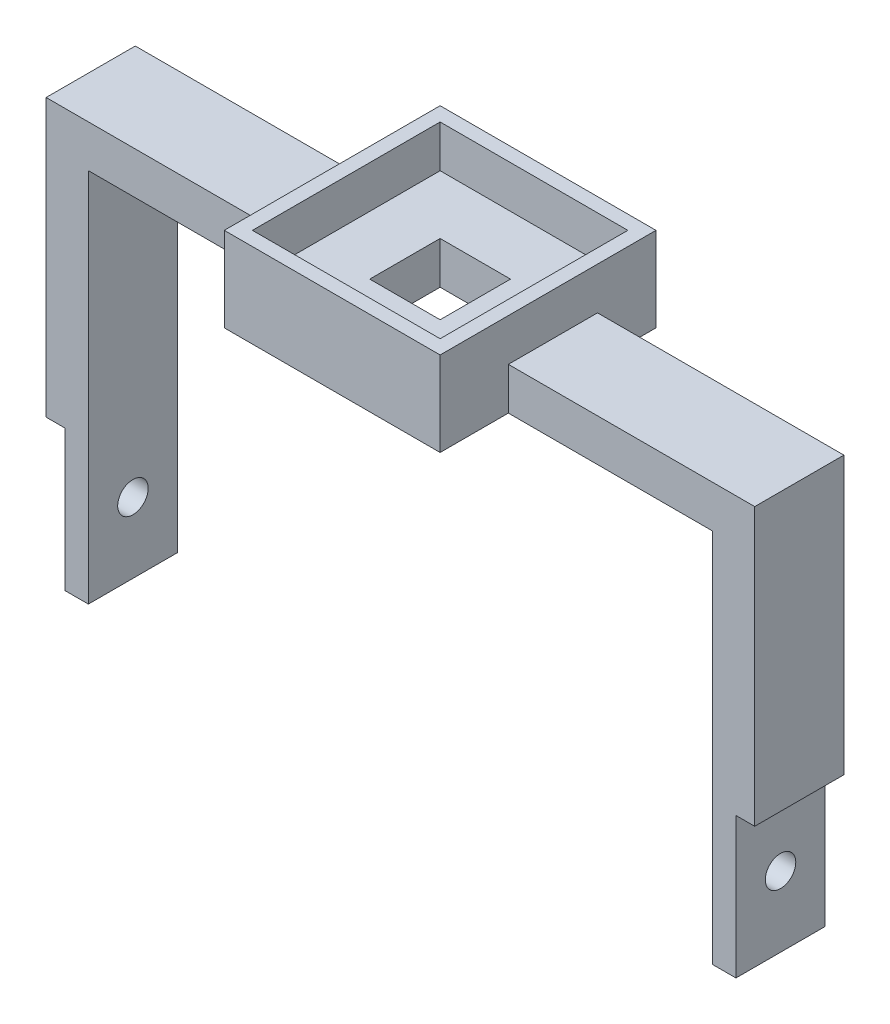
ISO-10303-21;
HEADER;
FILE_DESCRIPTION(('STEP AP214'),'2;1');
FILE_NAME('part.step','',(''),(''),'','','');
FILE_SCHEMA(('AUTOMOTIVE_DESIGN { 1 0 10303 214 1 1 1 1 }'));
ENDSEC;
DATA;
#1=APPLICATION_CONTEXT('core data for automotive mechanical design processes');
#2=APPLICATION_PROTOCOL_DEFINITION('international standard','automotive_design',2000,#1);
#3=PRODUCT_CONTEXT('',#1,'mechanical');
#4=PRODUCT('Part','Part','',(#3));
#5=PRODUCT_RELATED_PRODUCT_CATEGORY('part','',(#4));
#6=PRODUCT_DEFINITION_FORMATION('','',#4);
#7=PRODUCT_DEFINITION_CONTEXT('part definition',#1,'design');
#8=PRODUCT_DEFINITION('design','',#6,#7);
#9=PRODUCT_DEFINITION_SHAPE('','',#8);
#10=(LENGTH_UNIT() NAMED_UNIT(*) SI_UNIT(.MILLI.,.METRE.));
#11=(NAMED_UNIT(*) PLANE_ANGLE_UNIT() SI_UNIT($,.RADIAN.));
#12=(NAMED_UNIT(*) SI_UNIT($,.STERADIAN.) SOLID_ANGLE_UNIT());
#13=UNCERTAINTY_MEASURE_WITH_UNIT(LENGTH_MEASURE(1.E-05),#10,'distance_accuracy_value','');
#14=(GEOMETRIC_REPRESENTATION_CONTEXT(3) GLOBAL_UNCERTAINTY_ASSIGNED_CONTEXT((#13)) GLOBAL_UNIT_ASSIGNED_CONTEXT((#10,
#11,#12)) REPRESENTATION_CONTEXT('',''));
#15=CARTESIAN_POINT('',(0.,0.,0.));
#16=DIRECTION('',(0.,0.,1.));
#17=DIRECTION('',(1.,0.,0.));
#18=AXIS2_PLACEMENT_3D('',#15,#16,#17);
#19=CARTESIAN_POINT('',(0.,80.,19.));
#20=DIRECTION('',(0.,1.,0.));
#21=DIRECTION('',(0.,0.,1.));
#22=AXIS2_PLACEMENT_3D('',#19,#20,#21);
#23=PLANE('',#22);
#24=DIRECTION('',(1.,0.,0.));
#25=VECTOR('',#24,1.);
#26=CARTESIAN_POINT('',(0.,80.,19.));
#27=LINE('',#26,#25);
#28=CARTESIAN_POINT('',(89.5,80.,19.));
#29=VERTEX_POINT('',#28);
#30=CARTESIAN_POINT('',(133.,80.,19.));
#31=VERTEX_POINT('',#30);
#32=EDGE_CURVE('E330',#29,#31,#27,.T.);
#33=ORIENTED_EDGE('',*,*,#32,.F.);
#34=DIRECTION('',(0.,0.,1.));
#35=VECTOR('',#34,1.);
#36=CARTESIAN_POINT('',(89.5,80.,33.5381592490275));
#37=LINE('',#36,#35);
#38=CARTESIAN_POINT('',(89.5,80.,33.5381592490275));
#39=VERTEX_POINT('',#38);
#40=EDGE_CURVE('E282',#29,#39,#37,.T.);
#41=ORIENTED_EDGE('',*,*,#40,.T.);
#42=DIRECTION('',(-1.,0.,0.));
#43=VECTOR('',#42,1.);
#44=CARTESIAN_POINT('',(89.5,80.,33.5381592490275));
#45=LINE('',#44,#43);
#46=CARTESIAN_POINT('',(43.5,80.,33.5381592490275));
#47=VERTEX_POINT('',#46);
#48=EDGE_CURVE('E274',#39,#47,#45,.T.);
#49=ORIENTED_EDGE('',*,*,#48,.T.);
#50=DIRECTION('',(0.,0.,-1.));
#51=VECTOR('',#50,1.);
#52=CARTESIAN_POINT('',(43.5,80.,33.5381592490275));
#53=LINE('',#52,#51);
#54=CARTESIAN_POINT('',(43.5,80.,19.));
#55=VERTEX_POINT('',#54);
#56=EDGE_CURVE('E277',#47,#55,#53,.T.);
#57=ORIENTED_EDGE('',*,*,#56,.T.);
#58=CARTESIAN_POINT('',(0.,80.,19.));
#59=VERTEX_POINT('',#58);
#60=EDGE_CURVE('E331',#59,#55,#27,.T.);
#61=ORIENTED_EDGE('',*,*,#60,.F.);
#62=DIRECTION('',(0.,0.,-1.));
#63=VECTOR('',#62,1.);
#64=CARTESIAN_POINT('',(0.,80.,19.));
#65=LINE('',#64,#63);
#66=CARTESIAN_POINT('',(0.,80.,0.));
#67=VERTEX_POINT('',#66);
#68=EDGE_CURVE('E411',#59,#67,#65,.T.);
#69=ORIENTED_EDGE('',*,*,#68,.T.);
#70=DIRECTION('',(1.,0.,0.));
#71=VECTOR('',#70,1.);
#72=CARTESIAN_POINT('',(0.,80.,0.));
#73=LINE('',#72,#71);
#74=CARTESIAN_POINT('',(43.5,80.,0.));
#75=VERTEX_POINT('',#74);
#76=EDGE_CURVE('E360',#67,#75,#73,.T.);
#77=ORIENTED_EDGE('',*,*,#76,.T.);
#78=CARTESIAN_POINT('',(43.5,80.,-12.4618407509725));
#79=VERTEX_POINT('',#78);
#80=EDGE_CURVE('E284',#75,#79,#53,.T.);
#81=ORIENTED_EDGE('',*,*,#80,.T.);
#82=DIRECTION('',(1.,0.,0.));
#83=VECTOR('',#82,1.);
#84=CARTESIAN_POINT('',(89.5,80.,-12.4618407509725));
#85=LINE('',#84,#83);
#86=CARTESIAN_POINT('',(89.5,80.,-12.4618407509725));
#87=VERTEX_POINT('',#86);
#88=EDGE_CURVE('E281',#79,#87,#85,.T.);
#89=ORIENTED_EDGE('',*,*,#88,.T.);
#90=CARTESIAN_POINT('',(89.5,80.,0.));
#91=VERTEX_POINT('',#90);
#92=EDGE_CURVE('E278',#87,#91,#37,.T.);
#93=ORIENTED_EDGE('',*,*,#92,.T.);
#94=CARTESIAN_POINT('',(133.,80.,0.));
#95=VERTEX_POINT('',#94);
#96=EDGE_CURVE('E359',#91,#95,#73,.T.);
#97=ORIENTED_EDGE('',*,*,#96,.T.);
#98=DIRECTION('',(0.,0.,-1.));
#99=VECTOR('',#98,1.);
#100=CARTESIAN_POINT('',(133.,80.,19.));
#101=LINE('',#100,#99);
#102=EDGE_CURVE('E408',#31,#95,#101,.T.);
#103=ORIENTED_EDGE('',*,*,#102,.F.);
#104=EDGE_LOOP('',(#33,#41,#49,#57,#61,#69,#77,#81,#89,#93,#97,#103));
#105=FACE_BOUND('',#104,.T.);
#106=DIRECTION('',(0.,0.,1.));
#107=VECTOR('',#106,1.);
#108=CARTESIAN_POINT('',(59.,80.,18.0381592490275));
#109=LINE('',#108,#107);
#110=CARTESIAN_POINT('',(59.,80.,3.03815924902746));
#111=VERTEX_POINT('',#110);
#112=CARTESIAN_POINT('',(59.,80.,18.0381592490275));
#113=VERTEX_POINT('',#112);
#114=EDGE_CURVE('E49',#111,#113,#109,.T.);
#115=ORIENTED_EDGE('',*,*,#114,.T.);
#116=DIRECTION('',(1.,0.,0.));
#117=VECTOR('',#116,1.);
#118=CARTESIAN_POINT('',(74.,80.,18.0381592490275));
#119=LINE('',#118,#117);
#120=CARTESIAN_POINT('',(74.,80.,18.0381592490275));
#121=VERTEX_POINT('',#120);
#122=EDGE_CURVE('E227',#113,#121,#119,.T.);
#123=ORIENTED_EDGE('',*,*,#122,.T.);
#124=DIRECTION('',(0.,0.,-1.));
#125=VECTOR('',#124,1.);
#126=CARTESIAN_POINT('',(74.,80.,18.0381592490275));
#127=LINE('',#126,#125);
#128=CARTESIAN_POINT('',(74.,80.,3.03815924902746));
#129=VERTEX_POINT('',#128);
#130=EDGE_CURVE('E233',#121,#129,#127,.T.);
#131=ORIENTED_EDGE('',*,*,#130,.T.);
#132=DIRECTION('',(-1.,0.,0.));
#133=VECTOR('',#132,1.);
#134=CARTESIAN_POINT('',(74.,80.,3.03815924902746));
#135=LINE('',#134,#133);
#136=EDGE_CURVE('E236',#129,#111,#135,.T.);
#137=ORIENTED_EDGE('',*,*,#136,.T.);
#138=EDGE_LOOP('',(#115,#123,#131,#137));
#139=FACE_BOUND('',#138,.T.);
#140=ADVANCED_FACE('F33',(#105,#139),#23,.F.);
#141=CARTESIAN_POINT('',(142.,89.,19.));
#142=DIRECTION('',(0.,-1.,0.));
#143=DIRECTION('',(1.,0.,0.));
#144=AXIS2_PLACEMENT_3D('',#141,#142,#143);
#145=PLANE('',#144);
#146=DIRECTION('',(0.,0.,-1.));
#147=VECTOR('',#146,1.);
#148=CARTESIAN_POINT('',(86.5,89.,30.5381592490275));
#149=LINE('',#148,#147);
#150=CARTESIAN_POINT('',(86.5,89.,30.5381592490275));
#151=VERTEX_POINT('',#150);
#152=CARTESIAN_POINT('',(86.5,89.,-9.46184075097254));
#153=VERTEX_POINT('',#152);
#154=EDGE_CURVE('E312',#151,#153,#149,.T.);
#155=ORIENTED_EDGE('',*,*,#154,.T.);
#156=DIRECTION('',(-1.,0.,0.));
#157=VECTOR('',#156,1.);
#158=CARTESIAN_POINT('',(46.5,89.,-9.46184075097254));
#159=LINE('',#158,#157);
#160=CARTESIAN_POINT('',(46.5,89.,-9.46184075097254));
#161=VERTEX_POINT('',#160);
#162=EDGE_CURVE('E314',#153,#161,#159,.T.);
#163=ORIENTED_EDGE('',*,*,#162,.T.);
#164=DIRECTION('',(0.,0.,1.));
#165=VECTOR('',#164,1.);
#166=CARTESIAN_POINT('',(46.5,89.,30.5381592490275));
#167=LINE('',#166,#165);
#168=CARTESIAN_POINT('',(46.5,89.,30.5381592490275));
#169=VERTEX_POINT('',#168);
#170=EDGE_CURVE('E317',#161,#169,#167,.T.);
#171=ORIENTED_EDGE('',*,*,#170,.T.);
#172=DIRECTION('',(1.,0.,0.));
#173=VECTOR('',#172,1.);
#174=CARTESIAN_POINT('',(46.5,89.,30.5381592490275));
#175=LINE('',#174,#173);
#176=EDGE_CURVE('E320',#169,#151,#175,.T.);
#177=ORIENTED_EDGE('',*,*,#176,.T.);
#178=EDGE_LOOP('',(#155,#163,#171,#177));
#179=FACE_BOUND('',#178,.T.);
#180=DIRECTION('',(0.,0.,1.));
#181=VECTOR('',#180,1.);
#182=CARTESIAN_POINT('',(59.,89.,19.));
#183=LINE('',#182,#181);
#184=CARTESIAN_POINT('',(59.,89.,3.03815924902746));
#185=VERTEX_POINT('',#184);
#186=CARTESIAN_POINT('',(59.,89.,18.0381592490275));
#187=VERTEX_POINT('',#186);
#188=EDGE_CURVE('E11',#185,#187,#183,.T.);
#189=ORIENTED_EDGE('',*,*,#188,.F.);
#190=DIRECTION('',(-1.,0.,0.));
#191=VECTOR('',#190,1.);
#192=CARTESIAN_POINT('',(142.,89.,3.03815924902745));
#193=LINE('',#192,#191);
#194=CARTESIAN_POINT('',(74.,89.,3.03815924902746));
#195=VERTEX_POINT('',#194);
#196=EDGE_CURVE('E422',#195,#185,#193,.T.);
#197=ORIENTED_EDGE('',*,*,#196,.F.);
#198=DIRECTION('',(0.,0.,-1.));
#199=VECTOR('',#198,1.);
#200=CARTESIAN_POINT('',(74.,89.,19.));
#201=LINE('',#200,#199);
#202=CARTESIAN_POINT('',(74.,89.,18.0381592490275));
#203=VERTEX_POINT('',#202);
#204=EDGE_CURVE('E424',#203,#195,#201,.T.);
#205=ORIENTED_EDGE('',*,*,#204,.F.);
#206=DIRECTION('',(1.,0.,0.));
#207=VECTOR('',#206,1.);
#208=CARTESIAN_POINT('',(142.,89.,18.0381592490275));
#209=LINE('',#208,#207);
#210=EDGE_CURVE('E42',#187,#203,#209,.T.);
#211=ORIENTED_EDGE('',*,*,#210,.F.);
#212=EDGE_LOOP('',(#189,#197,#205,#211));
#213=FACE_BOUND('',#212,.T.);
#214=ADVANCED_FACE('F431',(#179,#213),#145,.F.);
#215=DIRECTION('',(-1.,0.,0.));
#216=VECTOR('',#215,1.);
#217=CARTESIAN_POINT('',(142.,89.,0.));
#218=LINE('',#217,#216);
#219=CARTESIAN_POINT('',(142.,89.,0.));
#220=VERTEX_POINT('',#219);
#221=CARTESIAN_POINT('',(89.5,89.,0.));
#222=VERTEX_POINT('',#221);
#223=EDGE_CURVE('E374',#220,#222,#218,.T.);
#224=ORIENTED_EDGE('',*,*,#223,.T.);
#225=DIRECTION('',(0.,0.,1.));
#226=VECTOR('',#225,1.);
#227=CARTESIAN_POINT('',(89.5,89.,19.));
#228=LINE('',#227,#226);
#229=CARTESIAN_POINT('',(89.5,89.,19.));
#230=VERTEX_POINT('',#229);
#231=EDGE_CURVE('E419',#222,#230,#228,.T.);
#232=ORIENTED_EDGE('',*,*,#231,.T.);
#233=DIRECTION('',(-1.,0.,0.));
#234=VECTOR('',#233,1.);
#235=CARTESIAN_POINT('',(142.,89.,19.));
#236=LINE('',#235,#234);
#237=CARTESIAN_POINT('',(142.,89.,19.));
#238=VERTEX_POINT('',#237);
#239=EDGE_CURVE('E345',#238,#230,#236,.T.);
#240=ORIENTED_EDGE('',*,*,#239,.F.);
#241=DIRECTION('',(0.,0.,-1.));
#242=VECTOR('',#241,1.);
#243=CARTESIAN_POINT('',(142.,89.,19.));
#244=LINE('',#243,#242);
#245=EDGE_CURVE('E393',#238,#220,#244,.T.);
#246=ORIENTED_EDGE('',*,*,#245,.T.);
#247=EDGE_LOOP('',(#224,#232,#240,#246));
#248=FACE_BOUND('',#247,.T.);
#249=ADVANCED_FACE('F450',(#248),#145,.F.);
#250=CARTESIAN_POINT('',(0.,0.,19.));
#251=DIRECTION('',(0.,0.,-1.));
#252=DIRECTION('',(-1.,0.,0.));
#253=AXIS2_PLACEMENT_3D('',#250,#251,#252);
#254=PLANE('',#253);
#255=ORIENTED_EDGE('',*,*,#239,.T.);
#256=DIRECTION('',(0.,-1.,0.));
#257=VECTOR('',#256,1.);
#258=CARTESIAN_POINT('',(89.5,0.,19.));
#259=LINE('',#258,#257);
#260=EDGE_CURVE('E309',#230,#29,#259,.T.);
#261=ORIENTED_EDGE('',*,*,#260,.T.);
#262=ORIENTED_EDGE('',*,*,#32,.T.);
#263=DIRECTION('',(0.,-1.,0.));
#264=VECTOR('',#263,1.);
#265=CARTESIAN_POINT('',(133.,80.,19.));
#266=LINE('',#265,#264);
#267=CARTESIAN_POINT('',(133.,0.,19.));
#268=VERTEX_POINT('',#267);
#269=EDGE_CURVE('E334',#31,#268,#266,.T.);
#270=ORIENTED_EDGE('',*,*,#269,.T.);
#271=DIRECTION('',(1.,0.,0.));
#272=VECTOR('',#271,1.);
#273=CARTESIAN_POINT('',(133.,0.,19.));
#274=LINE('',#273,#272);
#275=CARTESIAN_POINT('',(138.,0.,19.));
#276=VERTEX_POINT('',#275);
#277=EDGE_CURVE('E336',#268,#276,#274,.T.);
#278=ORIENTED_EDGE('',*,*,#277,.T.);
#279=DIRECTION('',(0.,1.,0.));
#280=VECTOR('',#279,1.);
#281=CARTESIAN_POINT('',(138.,0.,19.));
#282=LINE('',#281,#280);
#283=CARTESIAN_POINT('',(138.,30.,19.));
#284=VERTEX_POINT('',#283);
#285=EDGE_CURVE('E338',#276,#284,#282,.T.);
#286=ORIENTED_EDGE('',*,*,#285,.T.);
#287=DIRECTION('',(1.,0.,0.));
#288=VECTOR('',#287,1.);
#289=CARTESIAN_POINT('',(138.,30.,19.));
#290=LINE('',#289,#288);
#291=CARTESIAN_POINT('',(142.,30.,19.));
#292=VERTEX_POINT('',#291);
#293=EDGE_CURVE('E340',#284,#292,#290,.T.);
#294=ORIENTED_EDGE('',*,*,#293,.T.);
#295=DIRECTION('',(0.,1.,0.));
#296=VECTOR('',#295,1.);
#297=CARTESIAN_POINT('',(142.,30.,19.));
#298=LINE('',#297,#296);
#299=EDGE_CURVE('E342',#292,#238,#298,.T.);
#300=ORIENTED_EDGE('',*,*,#299,.T.);
#301=EDGE_LOOP('',(#255,#261,#262,#270,#278,#286,#294,#300));
#302=FACE_BOUND('',#301,.T.);
#303=ADVANCED_FACE('F542',(#302),#254,.F.);
#304=CARTESIAN_POINT('',(0.,0.,0.));
#305=DIRECTION('',(0.,0.,-1.));
#306=DIRECTION('',(-1.,0.,0.));
#307=AXIS2_PLACEMENT_3D('',#304,#305,#306);
#308=PLANE('',#307);
#309=DIRECTION('',(0.,-1.,0.));
#310=VECTOR('',#309,1.);
#311=CARTESIAN_POINT('',(89.5,0.,0.));
#312=LINE('',#311,#310);
#313=EDGE_CURVE('E307',#222,#91,#312,.T.);
#314=ORIENTED_EDGE('',*,*,#313,.F.);
#315=ORIENTED_EDGE('',*,*,#223,.F.);
#316=DIRECTION('',(0.,1.,0.));
#317=VECTOR('',#316,1.);
#318=CARTESIAN_POINT('',(142.,30.,0.));
#319=LINE('',#318,#317);
#320=CARTESIAN_POINT('',(142.,30.,0.));
#321=VERTEX_POINT('',#320);
#322=EDGE_CURVE('E371',#321,#220,#319,.T.);
#323=ORIENTED_EDGE('',*,*,#322,.F.);
#324=DIRECTION('',(1.,0.,0.));
#325=VECTOR('',#324,1.);
#326=CARTESIAN_POINT('',(138.,30.,0.));
#327=LINE('',#326,#325);
#328=CARTESIAN_POINT('',(138.,30.,0.));
#329=VERTEX_POINT('',#328);
#330=EDGE_CURVE('E369',#329,#321,#327,.T.);
#331=ORIENTED_EDGE('',*,*,#330,.F.);
#332=DIRECTION('',(0.,1.,0.));
#333=VECTOR('',#332,1.);
#334=CARTESIAN_POINT('',(138.,0.,0.));
#335=LINE('',#334,#333);
#336=CARTESIAN_POINT('',(138.,0.,0.));
#337=VERTEX_POINT('',#336);
#338=EDGE_CURVE('E367',#337,#329,#335,.T.);
#339=ORIENTED_EDGE('',*,*,#338,.F.);
#340=DIRECTION('',(1.,0.,0.));
#341=VECTOR('',#340,1.);
#342=CARTESIAN_POINT('',(133.,0.,0.));
#343=LINE('',#342,#341);
#344=CARTESIAN_POINT('',(133.,0.,0.));
#345=VERTEX_POINT('',#344);
#346=EDGE_CURVE('E365',#345,#337,#343,.T.);
#347=ORIENTED_EDGE('',*,*,#346,.F.);
#348=DIRECTION('',(0.,-1.,0.));
#349=VECTOR('',#348,1.);
#350=CARTESIAN_POINT('',(133.,80.,0.));
#351=LINE('',#350,#349);
#352=EDGE_CURVE('E363',#95,#345,#351,.T.);
#353=ORIENTED_EDGE('',*,*,#352,.F.);
#354=ORIENTED_EDGE('',*,*,#96,.F.);
#355=EDGE_LOOP('',(#314,#315,#323,#331,#339,#347,#353,#354));
#356=FACE_BOUND('',#355,.T.);
#357=ADVANCED_FACE('F467',(#356),#308,.T.);
#358=CARTESIAN_POINT('',(0.,0.,19.));
#359=DIRECTION('',(0.,1.,0.));
#360=DIRECTION('',(0.,0.,1.));
#361=AXIS2_PLACEMENT_3D('',#358,#359,#360);
#362=PLANE('',#361);
#363=DIRECTION('',(1.,0.,0.));
#364=VECTOR('',#363,1.);
#365=CARTESIAN_POINT('',(0.,0.,0.));
#366=LINE('',#365,#364);
#367=CARTESIAN_POINT('',(-5.,0.,0.));
#368=VERTEX_POINT('',#367);
#369=CARTESIAN_POINT('',(0.,0.,0.));
#370=VERTEX_POINT('',#369);
#371=EDGE_CURVE('E323',#368,#370,#366,.T.);
#372=ORIENTED_EDGE('',*,*,#371,.T.);
#373=DIRECTION('',(0.,0.,-1.));
#374=VECTOR('',#373,1.);
#375=CARTESIAN_POINT('',(0.,0.,19.));
#376=LINE('',#375,#374);
#377=CARTESIAN_POINT('',(0.,0.,19.));
#378=VERTEX_POINT('',#377);
#379=EDGE_CURVE('E414',#378,#370,#376,.T.);
#380=ORIENTED_EDGE('',*,*,#379,.F.);
#381=DIRECTION('',(1.,0.,0.));
#382=VECTOR('',#381,1.);
#383=CARTESIAN_POINT('',(0.,0.,19.));
#384=LINE('',#383,#382);
#385=CARTESIAN_POINT('',(-5.,0.,19.));
#386=VERTEX_POINT('',#385);
#387=EDGE_CURVE('E324',#386,#378,#384,.T.);
#388=ORIENTED_EDGE('',*,*,#387,.F.);
#389=DIRECTION('',(0.,0.,-1.));
#390=VECTOR('',#389,1.);
#391=CARTESIAN_POINT('',(-5.,0.,19.));
#392=LINE('',#391,#390);
#393=EDGE_CURVE('E354',#386,#368,#392,.T.);
#394=ORIENTED_EDGE('',*,*,#393,.T.);
#395=EDGE_LOOP('',(#372,#380,#388,#394));
#396=FACE_BOUND('',#395,.T.);
#397=ADVANCED_FACE('F35',(#396),#362,.F.);
#398=CARTESIAN_POINT('',(0.,0.,19.));
#399=DIRECTION('',(-1.,0.,0.));
#400=DIRECTION('',(0.,0.,1.));
#401=AXIS2_PLACEMENT_3D('',#398,#399,#400);
#402=PLANE('',#401);
#403=CARTESIAN_POINT('',(0.,15.,9.5));
#404=DIRECTION('',(-1.,0.,0.));
#405=DIRECTION('',(0.,0.,1.));
#406=AXIS2_PLACEMENT_3D('',#403,#404,#405);
#407=CIRCLE('',#406,3.25);
#408=CARTESIAN_POINT('',(0.,15.,6.25));
#409=VERTEX_POINT('',#408);
#410=EDGE_CURVE('E237',#409,#409,#407,.T.);
#411=ORIENTED_EDGE('',*,*,#410,.T.);
#412=EDGE_LOOP('',(#411));
#413=FACE_BOUND('',#412,.T.);
#414=DIRECTION('',(0.,1.,0.));
#415=VECTOR('',#414,1.);
#416=CARTESIAN_POINT('',(0.,0.,0.));
#417=LINE('',#416,#415);
#418=EDGE_CURVE('E357',#370,#67,#417,.T.);
#419=ORIENTED_EDGE('',*,*,#418,.T.);
#420=ORIENTED_EDGE('',*,*,#68,.F.);
#421=DIRECTION('',(0.,1.,0.));
#422=VECTOR('',#421,1.);
#423=CARTESIAN_POINT('',(0.,0.,19.));
#424=LINE('',#423,#422);
#425=EDGE_CURVE('E327',#378,#59,#424,.T.);
#426=ORIENTED_EDGE('',*,*,#425,.F.);
#427=ORIENTED_EDGE('',*,*,#379,.T.);
#428=EDGE_LOOP('',(#419,#420,#426,#427));
#429=FACE_BOUND('',#428,.T.);
#430=ADVANCED_FACE('F458',(#413,#429),#402,.F.);
#431=CARTESIAN_POINT('',(133.,80.,19.));
#432=DIRECTION('',(1.,0.,0.));
#433=DIRECTION('',(0.,0.,-1.));
#434=AXIS2_PLACEMENT_3D('',#431,#432,#433);
#435=PLANE('',#434);
#436=CARTESIAN_POINT('',(133.,15.,9.5));
#437=DIRECTION('',(1.,0.,0.));
#438=DIRECTION('',(0.,0.,-1.));
#439=AXIS2_PLACEMENT_3D('',#436,#437,#438);
#440=CIRCLE('',#439,3.25);
#441=CARTESIAN_POINT('',(133.,15.,6.25));
#442=VERTEX_POINT('',#441);
#443=EDGE_CURVE('E240',#442,#442,#440,.T.);
#444=ORIENTED_EDGE('',*,*,#443,.T.);
#445=EDGE_LOOP('',(#444));
#446=FACE_BOUND('',#445,.T.);
#447=ORIENTED_EDGE('',*,*,#352,.T.);
#448=DIRECTION('',(0.,0.,-1.));
#449=VECTOR('',#448,1.);
#450=CARTESIAN_POINT('',(133.,0.,19.));
#451=LINE('',#450,#449);
#452=EDGE_CURVE('E405',#268,#345,#451,.T.);
#453=ORIENTED_EDGE('',*,*,#452,.F.);
#454=ORIENTED_EDGE('',*,*,#269,.F.);
#455=ORIENTED_EDGE('',*,*,#102,.T.);
#456=EDGE_LOOP('',(#447,#453,#454,#455));
#457=FACE_BOUND('',#456,.T.);
#458=ADVANCED_FACE('F456',(#446,#457),#435,.F.);
#459=CARTESIAN_POINT('',(133.,0.,19.));
#460=DIRECTION('',(0.,1.,0.));
#461=DIRECTION('',(0.,0.,1.));
#462=AXIS2_PLACEMENT_3D('',#459,#460,#461);
#463=PLANE('',#462);
#464=ORIENTED_EDGE('',*,*,#346,.T.);
#465=DIRECTION('',(0.,0.,-1.));
#466=VECTOR('',#465,1.);
#467=CARTESIAN_POINT('',(138.,0.,19.));
#468=LINE('',#467,#466);
#469=EDGE_CURVE('E402',#276,#337,#468,.T.);
#470=ORIENTED_EDGE('',*,*,#469,.F.);
#471=ORIENTED_EDGE('',*,*,#277,.F.);
#472=ORIENTED_EDGE('',*,*,#452,.T.);
#473=EDGE_LOOP('',(#464,#470,#471,#472));
#474=FACE_BOUND('',#473,.T.);
#475=ADVANCED_FACE('F465',(#474),#463,.F.);
#476=CARTESIAN_POINT('',(138.,0.,19.));
#477=DIRECTION('',(-1.,0.,0.));
#478=DIRECTION('',(0.,0.,1.));
#479=AXIS2_PLACEMENT_3D('',#476,#477,#478);
#480=PLANE('',#479);
#481=CARTESIAN_POINT('',(138.,15.,9.5));
#482=DIRECTION('',(1.,0.,0.));
#483=DIRECTION('',(0.,0.,-1.));
#484=AXIS2_PLACEMENT_3D('',#481,#482,#483);
#485=CIRCLE('',#484,3.25);
#486=CARTESIAN_POINT('',(138.,15.,6.25));
#487=VERTEX_POINT('',#486);
#488=EDGE_CURVE('E809',#487,#487,#485,.T.);
#489=ORIENTED_EDGE('',*,*,#488,.F.);
#490=EDGE_LOOP('',(#489));
#491=FACE_BOUND('',#490,.T.);
#492=ORIENTED_EDGE('',*,*,#338,.T.);
#493=DIRECTION('',(0.,0.,-1.));
#494=VECTOR('',#493,1.);
#495=CARTESIAN_POINT('',(138.,30.,19.));
#496=LINE('',#495,#494);
#497=EDGE_CURVE('E399',#284,#329,#496,.T.);
#498=ORIENTED_EDGE('',*,*,#497,.F.);
#499=ORIENTED_EDGE('',*,*,#285,.F.);
#500=ORIENTED_EDGE('',*,*,#469,.T.);
#501=EDGE_LOOP('',(#492,#498,#499,#500));
#502=FACE_BOUND('',#501,.T.);
#503=ADVANCED_FACE('F533',(#491,#502),#480,.F.);
#504=CARTESIAN_POINT('',(138.,30.,19.));
#505=DIRECTION('',(0.,1.,0.));
#506=DIRECTION('',(0.,0.,1.));
#507=AXIS2_PLACEMENT_3D('',#504,#505,#506);
#508=PLANE('',#507);
#509=ORIENTED_EDGE('',*,*,#330,.T.);
#510=DIRECTION('',(0.,0.,-1.));
#511=VECTOR('',#510,1.);
#512=CARTESIAN_POINT('',(142.,30.,19.));
#513=LINE('',#512,#511);
#514=EDGE_CURVE('E396',#292,#321,#513,.T.);
#515=ORIENTED_EDGE('',*,*,#514,.F.);
#516=ORIENTED_EDGE('',*,*,#293,.F.);
#517=ORIENTED_EDGE('',*,*,#497,.T.);
#518=EDGE_LOOP('',(#509,#515,#516,#517));
#519=FACE_BOUND('',#518,.T.);
#520=ADVANCED_FACE('F528',(#519),#508,.F.);
#521=CARTESIAN_POINT('',(142.,30.,19.));
#522=DIRECTION('',(-1.,0.,0.));
#523=DIRECTION('',(0.,0.,1.));
#524=AXIS2_PLACEMENT_3D('',#521,#522,#523);
#525=PLANE('',#524);
#526=ORIENTED_EDGE('',*,*,#322,.T.);
#527=ORIENTED_EDGE('',*,*,#245,.F.);
#528=ORIENTED_EDGE('',*,*,#299,.F.);
#529=ORIENTED_EDGE('',*,*,#514,.T.);
#530=EDGE_LOOP('',(#526,#527,#528,#529));
#531=FACE_BOUND('',#530,.T.);
#532=ADVANCED_FACE('F522',(#531),#525,.F.);
#533=CARTESIAN_POINT('',(43.5,89.,19.));
#534=VERTEX_POINT('',#533);
#535=CARTESIAN_POINT('',(-9.,89.,19.));
#536=VERTEX_POINT('',#535);
#537=EDGE_CURVE('E344',#534,#536,#236,.T.);
#538=ORIENTED_EDGE('',*,*,#537,.F.);
#539=DIRECTION('',(0.,0.,-1.));
#540=VECTOR('',#539,1.);
#541=CARTESIAN_POINT('',(43.5,89.,19.));
#542=LINE('',#541,#540);
#543=CARTESIAN_POINT('',(43.5,89.,0.));
#544=VERTEX_POINT('',#543);
#545=EDGE_CURVE('E276',#534,#544,#542,.T.);
#546=ORIENTED_EDGE('',*,*,#545,.T.);
#547=CARTESIAN_POINT('',(-9.,89.,0.));
#548=VERTEX_POINT('',#547);
#549=EDGE_CURVE('E373',#544,#548,#218,.T.);
#550=ORIENTED_EDGE('',*,*,#549,.T.);
#551=DIRECTION('',(0.,0.,-1.));
#552=VECTOR('',#551,1.);
#553=CARTESIAN_POINT('',(-9.,89.,19.));
#554=LINE('',#553,#552);
#555=EDGE_CURVE('E390',#536,#548,#554,.T.);
#556=ORIENTED_EDGE('',*,*,#555,.F.);
#557=EDGE_LOOP('',(#538,#546,#550,#556));
#558=FACE_BOUND('',#557,.T.);
#559=ADVANCED_FACE('F453',(#558),#145,.F.);
#560=CARTESIAN_POINT('',(-9.,30.,19.));
#561=DIRECTION('',(1.,0.,0.));
#562=DIRECTION('',(0.,0.,-1.));
#563=AXIS2_PLACEMENT_3D('',#560,#561,#562);
#564=PLANE('',#563);
#565=DIRECTION('',(0.,-1.,0.));
#566=VECTOR('',#565,1.);
#567=CARTESIAN_POINT('',(-9.,30.,0.));
#568=LINE('',#567,#566);
#569=CARTESIAN_POINT('',(-9.,30.,0.));
#570=VERTEX_POINT('',#569);
#571=EDGE_CURVE('E377',#548,#570,#568,.T.);
#572=ORIENTED_EDGE('',*,*,#571,.T.);
#573=DIRECTION('',(0.,0.,-1.));
#574=VECTOR('',#573,1.);
#575=CARTESIAN_POINT('',(-9.,30.,19.));
#576=LINE('',#575,#574);
#577=CARTESIAN_POINT('',(-9.,30.,19.));
#578=VERTEX_POINT('',#577);
#579=EDGE_CURVE('E387',#578,#570,#576,.T.);
#580=ORIENTED_EDGE('',*,*,#579,.F.);
#581=DIRECTION('',(0.,-1.,0.));
#582=VECTOR('',#581,1.);
#583=CARTESIAN_POINT('',(-9.,30.,19.));
#584=LINE('',#583,#582);
#585=EDGE_CURVE('E348',#536,#578,#584,.T.);
#586=ORIENTED_EDGE('',*,*,#585,.F.);
#587=ORIENTED_EDGE('',*,*,#555,.T.);
#588=EDGE_LOOP('',(#572,#580,#586,#587));
#589=FACE_BOUND('',#588,.T.);
#590=ADVANCED_FACE('F563',(#589),#564,.F.);
#591=CARTESIAN_POINT('',(-5.,30.,19.));
#592=DIRECTION('',(0.,1.,0.));
#593=DIRECTION('',(0.,0.,1.));
#594=AXIS2_PLACEMENT_3D('',#591,#592,#593);
#595=PLANE('',#594);
#596=DIRECTION('',(1.,0.,0.));
#597=VECTOR('',#596,1.);
#598=CARTESIAN_POINT('',(-5.,30.,0.));
#599=LINE('',#598,#597);
#600=CARTESIAN_POINT('',(-5.,30.,0.));
#601=VERTEX_POINT('',#600);
#602=EDGE_CURVE('E379',#570,#601,#599,.T.);
#603=ORIENTED_EDGE('',*,*,#602,.T.);
#604=DIRECTION('',(0.,0.,-1.));
#605=VECTOR('',#604,1.);
#606=CARTESIAN_POINT('',(-5.,30.,19.));
#607=LINE('',#606,#605);
#608=CARTESIAN_POINT('',(-5.,30.,19.));
#609=VERTEX_POINT('',#608);
#610=EDGE_CURVE('E384',#609,#601,#607,.T.);
#611=ORIENTED_EDGE('',*,*,#610,.F.);
#612=DIRECTION('',(1.,0.,0.));
#613=VECTOR('',#612,1.);
#614=CARTESIAN_POINT('',(-5.,30.,19.));
#615=LINE('',#614,#613);
#616=EDGE_CURVE('E350',#578,#609,#615,.T.);
#617=ORIENTED_EDGE('',*,*,#616,.F.);
#618=ORIENTED_EDGE('',*,*,#579,.T.);
#619=EDGE_LOOP('',(#603,#611,#617,#618));
#620=FACE_BOUND('',#619,.T.);
#621=ADVANCED_FACE('F557',(#620),#595,.F.);
#622=CARTESIAN_POINT('',(-5.,0.,19.));
#623=DIRECTION('',(1.,0.,0.));
#624=DIRECTION('',(0.,0.,-1.));
#625=AXIS2_PLACEMENT_3D('',#622,#623,#624);
#626=PLANE('',#625);
#627=CARTESIAN_POINT('',(-5.,15.,9.5));
#628=DIRECTION('',(1.,0.,0.));
#629=DIRECTION('',(0.,0.,-1.));
#630=AXIS2_PLACEMENT_3D('',#627,#628,#629);
#631=CIRCLE('',#630,3.25);
#632=CARTESIAN_POINT('',(-5.,15.,6.25));
#633=VERTEX_POINT('',#632);
#634=EDGE_CURVE('E37',#633,#633,#631,.T.);
#635=ORIENTED_EDGE('',*,*,#634,.T.);
#636=EDGE_LOOP('',(#635));
#637=FACE_BOUND('',#636,.T.);
#638=DIRECTION('',(0.,-1.,0.));
#639=VECTOR('',#638,1.);
#640=CARTESIAN_POINT('',(-5.,0.,0.));
#641=LINE('',#640,#639);
#642=EDGE_CURVE('E328',#601,#368,#641,.T.);
#643=ORIENTED_EDGE('',*,*,#642,.T.);
#644=ORIENTED_EDGE('',*,*,#393,.F.);
#645=DIRECTION('',(0.,-1.,0.));
#646=VECTOR('',#645,1.);
#647=CARTESIAN_POINT('',(-5.,0.,19.));
#648=LINE('',#647,#646);
#649=EDGE_CURVE('E352',#609,#386,#648,.T.);
#650=ORIENTED_EDGE('',*,*,#649,.F.);
#651=ORIENTED_EDGE('',*,*,#610,.T.);
#652=EDGE_LOOP('',(#643,#644,#650,#651));
#653=FACE_BOUND('',#652,.T.);
#654=ADVANCED_FACE('F552',(#637,#653),#626,.F.);
#655=ORIENTED_EDGE('',*,*,#60,.T.);
#656=DIRECTION('',(0.,1.,0.));
#657=VECTOR('',#656,1.);
#658=CARTESIAN_POINT('',(43.5,0.,19.));
#659=LINE('',#658,#657);
#660=EDGE_CURVE('E304',#55,#534,#659,.T.);
#661=ORIENTED_EDGE('',*,*,#660,.T.);
#662=ORIENTED_EDGE('',*,*,#537,.T.);
#663=ORIENTED_EDGE('',*,*,#585,.T.);
#664=ORIENTED_EDGE('',*,*,#616,.T.);
#665=ORIENTED_EDGE('',*,*,#649,.T.);
#666=ORIENTED_EDGE('',*,*,#387,.T.);
#667=ORIENTED_EDGE('',*,*,#425,.T.);
#668=EDGE_LOOP('',(#655,#661,#662,#663,#664,#665,#666,#667));
#669=FACE_BOUND('',#668,.T.);
#670=ADVANCED_FACE('F489',(#669),#254,.F.);
#671=DIRECTION('',(0.,1.,0.));
#672=VECTOR('',#671,1.);
#673=CARTESIAN_POINT('',(43.5,0.,0.));
#674=LINE('',#673,#672);
#675=EDGE_CURVE('E417',#75,#544,#674,.T.);
#676=ORIENTED_EDGE('',*,*,#675,.F.);
#677=ORIENTED_EDGE('',*,*,#76,.F.);
#678=ORIENTED_EDGE('',*,*,#418,.F.);
#679=ORIENTED_EDGE('',*,*,#371,.F.);
#680=ORIENTED_EDGE('',*,*,#642,.F.);
#681=ORIENTED_EDGE('',*,*,#602,.F.);
#682=ORIENTED_EDGE('',*,*,#571,.F.);
#683=ORIENTED_EDGE('',*,*,#549,.F.);
#684=EDGE_LOOP('',(#676,#677,#678,#679,#680,#681,#682,#683));
#685=FACE_BOUND('',#684,.T.);
#686=ADVANCED_FACE('F478',(#685),#308,.T.);
#687=CARTESIAN_POINT('',(89.5,14.9461761308377,33.5381592490275));
#688=DIRECTION('',(1.,0.,0.));
#689=DIRECTION('',(0.,1.,0.));
#690=AXIS2_PLACEMENT_3D('',#687,#688,#689);
#691=PLANE('',#690);
#692=ORIENTED_EDGE('',*,*,#260,.F.);
#693=ORIENTED_EDGE('',*,*,#231,.F.);
#694=ORIENTED_EDGE('',*,*,#313,.T.);
#695=ORIENTED_EDGE('',*,*,#92,.F.);
#696=DIRECTION('',(0.,1.,0.));
#697=VECTOR('',#696,1.);
#698=CARTESIAN_POINT('',(89.5,14.9461761308377,-12.4618407509725));
#699=LINE('',#698,#697);
#700=CARTESIAN_POINT('',(89.5,98.,-12.4618407509725));
#701=VERTEX_POINT('',#700);
#702=EDGE_CURVE('E297',#87,#701,#699,.T.);
#703=ORIENTED_EDGE('',*,*,#702,.T.);
#704=DIRECTION('',(0.,0.,-1.));
#705=VECTOR('',#704,1.);
#706=CARTESIAN_POINT('',(89.5,98.,33.5381592490275));
#707=LINE('',#706,#705);
#708=CARTESIAN_POINT('',(89.5,98.,33.5381592490275));
#709=VERTEX_POINT('',#708);
#710=EDGE_CURVE('E267',#709,#701,#707,.T.);
#711=ORIENTED_EDGE('',*,*,#710,.F.);
#712=DIRECTION('',(0.,1.,0.));
#713=VECTOR('',#712,1.);
#714=CARTESIAN_POINT('',(89.5,14.9461761308377,33.5381592490275));
#715=LINE('',#714,#713);
#716=EDGE_CURVE('E299',#39,#709,#715,.T.);
#717=ORIENTED_EDGE('',*,*,#716,.F.);
#718=ORIENTED_EDGE('',*,*,#40,.F.);
#719=EDGE_LOOP('',(#692,#693,#694,#695,#703,#711,#717,#718));
#720=FACE_BOUND('',#719,.T.);
#721=ADVANCED_FACE('F511',(#720),#691,.T.);
#722=CARTESIAN_POINT('',(43.5,14.9461761308376,33.5381592490275));
#723=DIRECTION('',(-1.,0.,0.));
#724=DIRECTION('',(0.,-1.,0.));
#725=AXIS2_PLACEMENT_3D('',#722,#723,#724);
#726=PLANE('',#725);
#727=ORIENTED_EDGE('',*,*,#660,.F.);
#728=ORIENTED_EDGE('',*,*,#56,.F.);
#729=DIRECTION('',(0.,1.,0.));
#730=VECTOR('',#729,1.);
#731=CARTESIAN_POINT('',(43.5,14.9461761308376,33.5381592490275));
#732=LINE('',#731,#730);
#733=CARTESIAN_POINT('',(43.5,98.,33.5381592490275));
#734=VERTEX_POINT('',#733);
#735=EDGE_CURVE('E289',#47,#734,#732,.T.);
#736=ORIENTED_EDGE('',*,*,#735,.T.);
#737=DIRECTION('',(0.,0.,1.));
#738=VECTOR('',#737,1.);
#739=CARTESIAN_POINT('',(43.5,98.,33.5381592490275));
#740=LINE('',#739,#738);
#741=CARTESIAN_POINT('',(43.5,98.,-12.4618407509725));
#742=VERTEX_POINT('',#741);
#743=EDGE_CURVE('E261',#742,#734,#740,.T.);
#744=ORIENTED_EDGE('',*,*,#743,.F.);
#745=DIRECTION('',(0.,1.,0.));
#746=VECTOR('',#745,1.);
#747=CARTESIAN_POINT('',(43.5,14.9461761308376,-12.4618407509725));
#748=LINE('',#747,#746);
#749=EDGE_CURVE('E295',#79,#742,#748,.T.);
#750=ORIENTED_EDGE('',*,*,#749,.F.);
#751=ORIENTED_EDGE('',*,*,#80,.F.);
#752=ORIENTED_EDGE('',*,*,#675,.T.);
#753=ORIENTED_EDGE('',*,*,#545,.F.);
#754=EDGE_LOOP('',(#727,#728,#736,#744,#750,#751,#752,#753));
#755=FACE_BOUND('',#754,.T.);
#756=ADVANCED_FACE('F482',(#755),#726,.T.);
#757=CARTESIAN_POINT('',(86.5,14.9461761308377,-9.46184075097254));
#758=DIRECTION('',(0.,0.,-1.));
#759=DIRECTION('',(-1.,0.,0.));
#760=AXIS2_PLACEMENT_3D('',#757,#758,#759);
#761=PLANE('',#760);
#762=DIRECTION('',(0.,1.,0.));
#763=VECTOR('',#762,1.);
#764=CARTESIAN_POINT('',(46.5,14.9461761308376,-9.46184075097254));
#765=LINE('',#764,#763);
#766=CARTESIAN_POINT('',(46.5,98.,-9.46184075097254));
#767=VERTEX_POINT('',#766);
#768=EDGE_CURVE('E287',#161,#767,#765,.T.);
#769=ORIENTED_EDGE('',*,*,#768,.F.);
#770=ORIENTED_EDGE('',*,*,#162,.F.);
#771=DIRECTION('',(0.,1.,0.));
#772=VECTOR('',#771,1.);
#773=CARTESIAN_POINT('',(86.5,14.9461761308377,-9.46184075097254));
#774=LINE('',#773,#772);
#775=CARTESIAN_POINT('',(86.5,98.,-9.46184075097254));
#776=VERTEX_POINT('',#775);
#777=EDGE_CURVE('E290',#153,#776,#774,.T.);
#778=ORIENTED_EDGE('',*,*,#777,.T.);
#779=DIRECTION('',(-1.,0.,0.));
#780=VECTOR('',#779,1.);
#781=CARTESIAN_POINT('',(86.5,98.,-9.46184075097254));
#782=LINE('',#781,#780);
#783=EDGE_CURVE('E258',#776,#767,#782,.T.);
#784=ORIENTED_EDGE('',*,*,#783,.T.);
#785=EDGE_LOOP('',(#769,#770,#778,#784));
#786=FACE_BOUND('',#785,.T.);
#787=ADVANCED_FACE('F753',(#786),#761,.F.);
#788=CARTESIAN_POINT('',(86.5,14.9461761308377,30.5381592490275));
#789=DIRECTION('',(0.,0.,1.));
#790=DIRECTION('',(1.,0.,0.));
#791=AXIS2_PLACEMENT_3D('',#788,#789,#790);
#792=PLANE('',#791);
#793=DIRECTION('',(0.,1.,0.));
#794=VECTOR('',#793,1.);
#795=CARTESIAN_POINT('',(86.5,14.9461761308377,30.5381592490275));
#796=LINE('',#795,#794);
#797=CARTESIAN_POINT('',(86.5,98.,30.5381592490275));
#798=VERTEX_POINT('',#797);
#799=EDGE_CURVE('E292',#151,#798,#796,.T.);
#800=ORIENTED_EDGE('',*,*,#799,.F.);
#801=ORIENTED_EDGE('',*,*,#176,.F.);
#802=DIRECTION('',(0.,1.,0.));
#803=VECTOR('',#802,1.);
#804=CARTESIAN_POINT('',(46.5,14.9461761308376,30.5381592490275));
#805=LINE('',#804,#803);
#806=CARTESIAN_POINT('',(46.5,98.,30.5381592490275));
#807=VERTEX_POINT('',#806);
#808=EDGE_CURVE('E273',#169,#807,#805,.T.);
#809=ORIENTED_EDGE('',*,*,#808,.T.);
#810=DIRECTION('',(1.,0.,0.));
#811=VECTOR('',#810,1.);
#812=CARTESIAN_POINT('',(86.5,98.,30.5381592490275));
#813=LINE('',#812,#811);
#814=EDGE_CURVE('E252',#807,#798,#813,.T.);
#815=ORIENTED_EDGE('',*,*,#814,.T.);
#816=EDGE_LOOP('',(#800,#801,#809,#815));
#817=FACE_BOUND('',#816,.T.);
#818=ADVANCED_FACE('F743',(#817),#792,.F.);
#819=CARTESIAN_POINT('',(86.5,14.9461761308377,30.5381592490275));
#820=DIRECTION('',(1.,0.,0.));
#821=DIRECTION('',(0.,1.,0.));
#822=AXIS2_PLACEMENT_3D('',#819,#820,#821);
#823=PLANE('',#822);
#824=ORIENTED_EDGE('',*,*,#777,.F.);
#825=ORIENTED_EDGE('',*,*,#154,.F.);
#826=ORIENTED_EDGE('',*,*,#799,.T.);
#827=DIRECTION('',(0.,0.,-1.));
#828=VECTOR('',#827,1.);
#829=CARTESIAN_POINT('',(86.5,98.,30.5381592490275));
#830=LINE('',#829,#828);
#831=EDGE_CURVE('E255',#798,#776,#830,.T.);
#832=ORIENTED_EDGE('',*,*,#831,.T.);
#833=EDGE_LOOP('',(#824,#825,#826,#832));
#834=FACE_BOUND('',#833,.T.);
#835=ADVANCED_FACE('F733',(#834),#823,.F.);
#836=CARTESIAN_POINT('',(46.5,14.9461761308376,30.5381592490275));
#837=DIRECTION('',(-1.,0.,0.));
#838=DIRECTION('',(0.,-1.,0.));
#839=AXIS2_PLACEMENT_3D('',#836,#837,#838);
#840=PLANE('',#839);
#841=ORIENTED_EDGE('',*,*,#808,.F.);
#842=ORIENTED_EDGE('',*,*,#170,.F.);
#843=ORIENTED_EDGE('',*,*,#768,.T.);
#844=DIRECTION('',(0.,0.,1.));
#845=VECTOR('',#844,1.);
#846=CARTESIAN_POINT('',(46.5,98.,30.5381592490275));
#847=LINE('',#846,#845);
#848=EDGE_CURVE('E223',#767,#807,#847,.T.);
#849=ORIENTED_EDGE('',*,*,#848,.T.);
#850=EDGE_LOOP('',(#841,#842,#843,#849));
#851=FACE_BOUND('',#850,.T.);
#852=ADVANCED_FACE('F724',(#851),#840,.F.);
#853=CARTESIAN_POINT('',(89.5,14.9461761308377,33.5381592490275));
#854=DIRECTION('',(0.,0.,1.));
#855=DIRECTION('',(1.,0.,0.));
#856=AXIS2_PLACEMENT_3D('',#853,#854,#855);
#857=PLANE('',#856);
#858=ORIENTED_EDGE('',*,*,#48,.F.);
#859=ORIENTED_EDGE('',*,*,#716,.T.);
#860=DIRECTION('',(1.,0.,0.));
#861=VECTOR('',#860,1.);
#862=CARTESIAN_POINT('',(89.5,98.,33.5381592490275));
#863=LINE('',#862,#861);
#864=EDGE_CURVE('E264',#734,#709,#863,.T.);
#865=ORIENTED_EDGE('',*,*,#864,.F.);
#866=ORIENTED_EDGE('',*,*,#735,.F.);
#867=EDGE_LOOP('',(#858,#859,#865,#866));
#868=FACE_BOUND('',#867,.T.);
#869=ADVANCED_FACE('F496',(#868),#857,.T.);
#870=CARTESIAN_POINT('',(89.5,14.9461761308377,-12.4618407509725));
#871=DIRECTION('',(0.,0.,-1.));
#872=DIRECTION('',(-1.,0.,0.));
#873=AXIS2_PLACEMENT_3D('',#870,#871,#872);
#874=PLANE('',#873);
#875=ORIENTED_EDGE('',*,*,#88,.F.);
#876=ORIENTED_EDGE('',*,*,#749,.T.);
#877=DIRECTION('',(-1.,0.,0.));
#878=VECTOR('',#877,1.);
#879=CARTESIAN_POINT('',(89.5,98.,-12.4618407509725));
#880=LINE('',#879,#878);
#881=EDGE_CURVE('E270',#701,#742,#880,.T.);
#882=ORIENTED_EDGE('',*,*,#881,.F.);
#883=ORIENTED_EDGE('',*,*,#702,.F.);
#884=EDGE_LOOP('',(#875,#876,#882,#883));
#885=FACE_BOUND('',#884,.T.);
#886=ADVANCED_FACE('F507',(#885),#874,.T.);
#887=CARTESIAN_POINT('',(0.,98.,0.));
#888=DIRECTION('',(0.,1.,0.));
#889=DIRECTION('',(-1.,0.,0.));
#890=AXIS2_PLACEMENT_3D('',#887,#888,#889);
#891=PLANE('',#890);
#892=ORIENTED_EDGE('',*,*,#743,.T.);
#893=ORIENTED_EDGE('',*,*,#864,.T.);
#894=ORIENTED_EDGE('',*,*,#710,.T.);
#895=ORIENTED_EDGE('',*,*,#881,.T.);
#896=EDGE_LOOP('',(#892,#893,#894,#895));
#897=FACE_BOUND('',#896,.T.);
#898=ORIENTED_EDGE('',*,*,#814,.F.);
#899=ORIENTED_EDGE('',*,*,#848,.F.);
#900=ORIENTED_EDGE('',*,*,#783,.F.);
#901=ORIENTED_EDGE('',*,*,#831,.F.);
#902=EDGE_LOOP('',(#898,#899,#900,#901));
#903=FACE_BOUND('',#902,.T.);
#904=ADVANCED_FACE('F500',(#897,#903),#891,.T.);
#905=CARTESIAN_POINT('',(59.,98.,18.0381592490275));
#906=DIRECTION('',(1.,0.,0.));
#907=DIRECTION('',(0.,1.,0.));
#908=AXIS2_PLACEMENT_3D('',#905,#906,#907);
#909=PLANE('',#908);
#910=ORIENTED_EDGE('',*,*,#188,.T.);
#911=DIRECTION('',(0.,-1.,0.));
#912=VECTOR('',#911,1.);
#913=CARTESIAN_POINT('',(59.,98.,18.0381592490275));
#914=LINE('',#913,#912);
#915=EDGE_CURVE('E217',#187,#113,#914,.T.);
#916=ORIENTED_EDGE('',*,*,#915,.T.);
#917=ORIENTED_EDGE('',*,*,#114,.F.);
#918=DIRECTION('',(0.,-1.,0.));
#919=VECTOR('',#918,1.);
#920=CARTESIAN_POINT('',(59.,98.,3.03815924902746));
#921=LINE('',#920,#919);
#922=EDGE_CURVE('E246',#185,#111,#921,.T.);
#923=ORIENTED_EDGE('',*,*,#922,.F.);
#924=EDGE_LOOP('',(#910,#916,#917,#923));
#925=FACE_BOUND('',#924,.T.);
#926=ADVANCED_FACE('F219',(#925),#909,.T.);
#927=CARTESIAN_POINT('',(74.,98.,18.0381592490275));
#928=DIRECTION('',(0.,0.,-1.));
#929=DIRECTION('',(-1.,0.,0.));
#930=AXIS2_PLACEMENT_3D('',#927,#928,#929);
#931=PLANE('',#930);
#932=ORIENTED_EDGE('',*,*,#210,.T.);
#933=DIRECTION('',(0.,-1.,0.));
#934=VECTOR('',#933,1.);
#935=CARTESIAN_POINT('',(74.,98.,18.0381592490275));
#936=LINE('',#935,#934);
#937=EDGE_CURVE('E224',#203,#121,#936,.T.);
#938=ORIENTED_EDGE('',*,*,#937,.T.);
#939=ORIENTED_EDGE('',*,*,#122,.F.);
#940=ORIENTED_EDGE('',*,*,#915,.F.);
#941=EDGE_LOOP('',(#932,#938,#939,#940));
#942=FACE_BOUND('',#941,.T.);
#943=ADVANCED_FACE('F228',(#942),#931,.T.);
#944=CARTESIAN_POINT('',(74.,98.,18.0381592490275));
#945=DIRECTION('',(-1.,0.,0.));
#946=DIRECTION('',(0.,-1.,0.));
#947=AXIS2_PLACEMENT_3D('',#944,#945,#946);
#948=PLANE('',#947);
#949=ORIENTED_EDGE('',*,*,#204,.T.);
#950=DIRECTION('',(0.,-1.,0.));
#951=VECTOR('',#950,1.);
#952=CARTESIAN_POINT('',(74.,98.,3.03815924902746));
#953=LINE('',#952,#951);
#954=EDGE_CURVE('E57',#195,#129,#953,.T.);
#955=ORIENTED_EDGE('',*,*,#954,.T.);
#956=ORIENTED_EDGE('',*,*,#130,.F.);
#957=ORIENTED_EDGE('',*,*,#937,.F.);
#958=EDGE_LOOP('',(#949,#955,#956,#957));
#959=FACE_BOUND('',#958,.T.);
#960=ADVANCED_FACE('F429',(#959),#948,.T.);
#961=CARTESIAN_POINT('',(74.,98.,3.03815924902746));
#962=DIRECTION('',(0.,0.,1.));
#963=DIRECTION('',(1.,0.,0.));
#964=AXIS2_PLACEMENT_3D('',#961,#962,#963);
#965=PLANE('',#964);
#966=ORIENTED_EDGE('',*,*,#196,.T.);
#967=ORIENTED_EDGE('',*,*,#922,.T.);
#968=ORIENTED_EDGE('',*,*,#136,.F.);
#969=ORIENTED_EDGE('',*,*,#954,.F.);
#970=EDGE_LOOP('',(#966,#967,#968,#969));
#971=FACE_BOUND('',#970,.T.);
#972=ADVANCED_FACE('F432',(#971),#965,.T.);
#973=CARTESIAN_POINT('',(-25.,15.,9.5));
#974=DIRECTION('',(1.,0.,0.));
#975=DIRECTION('',(0.,0.,-1.));
#976=AXIS2_PLACEMENT_3D('',#973,#974,#975);
#977=CYLINDRICAL_SURFACE('',#976,3.25);
#978=CARTESIAN_POINT('',(-5.,15.,6.25));
#979=CARTESIAN_POINT('',(-4.94791666666667,15.,6.25));
#980=CARTESIAN_POINT('',(-4.89583333333333,15.,6.25));
#981=CARTESIAN_POINT('',(-4.79166666666667,15.,6.25));
#982=CARTESIAN_POINT('',(-4.73958333333333,15.,6.25));
#983=CARTESIAN_POINT('',(-4.63541666666667,15.,6.25));
#984=CARTESIAN_POINT('',(-4.58333333333333,15.,6.25));
#985=CARTESIAN_POINT('',(-4.47916666666667,15.,6.25));
#986=CARTESIAN_POINT('',(-4.42708333333333,15.,6.25));
#987=CARTESIAN_POINT('',(-4.32291666666667,15.,6.25));
#988=CARTESIAN_POINT('',(-4.27083333333333,15.,6.25));
#989=CARTESIAN_POINT('',(-4.16666666666667,15.,6.25));
#990=CARTESIAN_POINT('',(-4.11458333333333,15.,6.25));
#991=CARTESIAN_POINT('',(-4.01041666666667,15.,6.25));
#992=CARTESIAN_POINT('',(-3.95833333333333,15.,6.25));
#993=CARTESIAN_POINT('',(-3.85416666666667,15.,6.25));
#994=CARTESIAN_POINT('',(-3.80208333333333,15.,6.25));
#995=CARTESIAN_POINT('',(-3.69791666666667,15.,6.25));
#996=CARTESIAN_POINT('',(-3.64583333333333,15.,6.25));
#997=CARTESIAN_POINT('',(-3.54166666666667,15.,6.25));
#998=CARTESIAN_POINT('',(-3.48958333333333,15.,6.25));
#999=CARTESIAN_POINT('',(-3.38541666666667,15.,6.25));
#1000=CARTESIAN_POINT('',(-3.33333333333333,15.,6.25));
#1001=CARTESIAN_POINT('',(-3.22916666666667,15.,6.25));
#1002=CARTESIAN_POINT('',(-3.17708333333333,15.,6.25));
#1003=CARTESIAN_POINT('',(-3.07291666666667,15.,6.25));
#1004=CARTESIAN_POINT('',(-3.02083333333333,15.,6.25));
#1005=CARTESIAN_POINT('',(-2.91666666666667,15.,6.25));
#1006=CARTESIAN_POINT('',(-2.86458333333333,15.,6.25));
#1007=CARTESIAN_POINT('',(-2.76041666666667,15.,6.25));
#1008=CARTESIAN_POINT('',(-2.70833333333333,15.,6.25));
#1009=CARTESIAN_POINT('',(-2.60416666666667,15.,6.25));
#1010=CARTESIAN_POINT('',(-2.55208333333333,15.,6.25));
#1011=CARTESIAN_POINT('',(-2.44791666666667,15.,6.25));
#1012=CARTESIAN_POINT('',(-2.39583333333333,15.,6.25));
#1013=CARTESIAN_POINT('',(-2.29166666666667,15.,6.25));
#1014=CARTESIAN_POINT('',(-2.23958333333333,15.,6.25));
#1015=CARTESIAN_POINT('',(-2.13541666666667,15.,6.25));
#1016=CARTESIAN_POINT('',(-2.08333333333333,15.,6.25));
#1017=CARTESIAN_POINT('',(-1.97916666666667,15.,6.25));
#1018=CARTESIAN_POINT('',(-1.92708333333333,15.,6.25));
#1019=CARTESIAN_POINT('',(-1.82291666666666,15.,6.25));
#1020=CARTESIAN_POINT('',(-1.77083333333333,15.,6.25));
#1021=CARTESIAN_POINT('',(-1.66666666666666,15.,6.25));
#1022=CARTESIAN_POINT('',(-1.61458333333333,15.,6.25));
#1023=CARTESIAN_POINT('',(-1.51041666666666,15.,6.25));
#1024=CARTESIAN_POINT('',(-1.45833333333333,15.,6.25));
#1025=CARTESIAN_POINT('',(-1.35416666666666,15.,6.25));
#1026=CARTESIAN_POINT('',(-1.30208333333333,15.,6.25));
#1027=CARTESIAN_POINT('',(-1.19791666666666,15.,6.25));
#1028=CARTESIAN_POINT('',(-1.14583333333333,15.,6.25));
#1029=CARTESIAN_POINT('',(-1.04166666666666,15.,6.25));
#1030=CARTESIAN_POINT('',(-0.989583333333331,15.,6.25));
#1031=CARTESIAN_POINT('',(-0.885416666666664,15.,6.25));
#1032=CARTESIAN_POINT('',(-0.833333333333331,15.,6.25));
#1033=CARTESIAN_POINT('',(-0.729166666666664,15.,6.25));
#1034=CARTESIAN_POINT('',(-0.67708333333333,15.,6.25));
#1035=CARTESIAN_POINT('',(-0.572916666666664,15.,6.25));
#1036=CARTESIAN_POINT('',(-0.52083333333333,15.,6.25));
#1037=CARTESIAN_POINT('',(-0.416666666666664,15.,6.25));
#1038=CARTESIAN_POINT('',(-0.36458333333333,15.,6.25));
#1039=CARTESIAN_POINT('',(-0.260416666666663,15.,6.25));
#1040=CARTESIAN_POINT('',(-0.20833333333333,15.,6.25));
#1041=CARTESIAN_POINT('',(-0.104166666666663,15.,6.25));
#1042=CARTESIAN_POINT('',(-0.05208333333333,15.,6.25));
#1043=CARTESIAN_POINT('',(0.,15.,6.25));
#1044=B_SPLINE_CURVE_WITH_KNOTS('',3,(#978,#979,#980,#981,#982,#983,#984,#985,#986,#987,#988,
#989,#990,#991,#992,#993,#994,#995,#996,#997,#998,#999,#1000,#1001,#1002,#1003,#1004,#1005,
#1006,#1007,#1008,#1009,#1010,#1011,#1012,#1013,#1014,#1015,#1016,#1017,#1018,#1019,#1020,#1021,
#1022,#1023,#1024,#1025,#1026,#1027,#1028,#1029,#1030,#1031,#1032,#1033,#1034,#1035,#1036,#1037,
#1038,#1039,#1040,#1041,#1042,#1043),.UNSPECIFIED.,.F.,.F.,(4,2,2,2,2,2,2,2,2,2,2,2,2,2,2,2,2,2,
2,2,2,2,2,2,2,2,2,2,2,2,2,2,4),(0.,0.15625,0.3125,0.46875,0.625000000000001,0.781250000000001,
0.937500000000001,1.09375,1.25,1.40625,1.5625,1.71875,1.875,2.03125,2.1875,2.34375,2.5,2.65625,
2.8125,2.96875,3.125,3.28125,3.4375,3.59375,3.75,3.90625,4.0625,4.21875,4.375,4.53125,4.6875,
4.84375,5.),.UNSPECIFIED.);
#1045=EDGE_CURVE('BSEAM434',#633,#409,#1044,.T.);
#1046=ORIENTED_EDGE('',*,*,#634,.F.);
#1047=ORIENTED_EDGE('',*,*,#410,.F.);
#1048=ORIENTED_EDGE('',*,*,#1045,.T.);
#1049=ORIENTED_EDGE('',*,*,#1045,.F.);
#1050=EDGE_LOOP('',(#1046,#1048,#1047,#1049));
#1051=FACE_BOUND('',#1050,.T.);
#1052=ADVANCED_FACE('F434',(#1051),#977,.F.);
#1053=CARTESIAN_POINT('',(138.,15.,6.25));
#1054=CARTESIAN_POINT('',(137.947916666667,15.,6.25));
#1055=CARTESIAN_POINT('',(137.895833333333,15.,6.25));
#1056=CARTESIAN_POINT('',(137.791666666667,15.,6.25));
#1057=CARTESIAN_POINT('',(137.739583333333,15.,6.25));
#1058=CARTESIAN_POINT('',(137.635416666667,15.,6.25));
#1059=CARTESIAN_POINT('',(137.583333333333,15.,6.25));
#1060=CARTESIAN_POINT('',(137.479166666667,15.,6.25));
#1061=CARTESIAN_POINT('',(137.427083333333,15.,6.25));
#1062=CARTESIAN_POINT('',(137.322916666667,15.,6.25));
#1063=CARTESIAN_POINT('',(137.270833333333,15.,6.25));
#1064=CARTESIAN_POINT('',(137.166666666667,15.,6.25));
#1065=CARTESIAN_POINT('',(137.114583333333,15.,6.25));
#1066=CARTESIAN_POINT('',(137.010416666667,15.,6.25));
#1067=CARTESIAN_POINT('',(136.958333333333,15.,6.25));
#1068=CARTESIAN_POINT('',(136.854166666667,15.,6.25));
#1069=CARTESIAN_POINT('',(136.802083333333,15.,6.25));
#1070=CARTESIAN_POINT('',(136.697916666667,15.,6.25));
#1071=CARTESIAN_POINT('',(136.645833333333,15.,6.25));
#1072=CARTESIAN_POINT('',(136.541666666667,15.,6.25));
#1073=CARTESIAN_POINT('',(136.489583333333,15.,6.25));
#1074=CARTESIAN_POINT('',(136.385416666667,15.,6.25));
#1075=CARTESIAN_POINT('',(136.333333333333,15.,6.25));
#1076=CARTESIAN_POINT('',(136.229166666667,15.,6.25));
#1077=CARTESIAN_POINT('',(136.177083333333,15.,6.25));
#1078=CARTESIAN_POINT('',(136.072916666667,15.,6.25));
#1079=CARTESIAN_POINT('',(136.020833333333,15.,6.25));
#1080=CARTESIAN_POINT('',(135.916666666667,15.,6.25));
#1081=CARTESIAN_POINT('',(135.864583333333,15.,6.25));
#1082=CARTESIAN_POINT('',(135.760416666667,15.,6.25));
#1083=CARTESIAN_POINT('',(135.708333333333,15.,6.25));
#1084=CARTESIAN_POINT('',(135.604166666667,15.,6.25));
#1085=CARTESIAN_POINT('',(135.552083333333,15.,6.25));
#1086=CARTESIAN_POINT('',(135.447916666667,15.,6.25));
#1087=CARTESIAN_POINT('',(135.395833333333,15.,6.25));
#1088=CARTESIAN_POINT('',(135.291666666667,15.,6.25));
#1089=CARTESIAN_POINT('',(135.239583333333,15.,6.25));
#1090=CARTESIAN_POINT('',(135.135416666667,15.,6.25));
#1091=CARTESIAN_POINT('',(135.083333333333,15.,6.25));
#1092=CARTESIAN_POINT('',(134.979166666667,15.,6.25));
#1093=CARTESIAN_POINT('',(134.927083333333,15.,6.25));
#1094=CARTESIAN_POINT('',(134.822916666667,15.,6.25));
#1095=CARTESIAN_POINT('',(134.770833333333,15.,6.25));
#1096=CARTESIAN_POINT('',(134.666666666667,15.,6.25));
#1097=CARTESIAN_POINT('',(134.614583333333,15.,6.25));
#1098=CARTESIAN_POINT('',(134.510416666667,15.,6.25));
#1099=CARTESIAN_POINT('',(134.458333333333,15.,6.25));
#1100=CARTESIAN_POINT('',(134.354166666667,15.,6.25));
#1101=CARTESIAN_POINT('',(134.302083333333,15.,6.25));
#1102=CARTESIAN_POINT('',(134.197916666667,15.,6.25));
#1103=CARTESIAN_POINT('',(134.145833333333,15.,6.25));
#1104=CARTESIAN_POINT('',(134.041666666667,15.,6.25));
#1105=CARTESIAN_POINT('',(133.989583333333,15.,6.25));
#1106=CARTESIAN_POINT('',(133.885416666667,15.,6.25));
#1107=CARTESIAN_POINT('',(133.833333333333,15.,6.25));
#1108=CARTESIAN_POINT('',(133.729166666667,15.,6.25));
#1109=CARTESIAN_POINT('',(133.677083333333,15.,6.25));
#1110=CARTESIAN_POINT('',(133.572916666667,15.,6.25));
#1111=CARTESIAN_POINT('',(133.520833333333,15.,6.25));
#1112=CARTESIAN_POINT('',(133.416666666667,15.,6.25));
#1113=CARTESIAN_POINT('',(133.364583333333,15.,6.25));
#1114=CARTESIAN_POINT('',(133.260416666667,15.,6.25));
#1115=CARTESIAN_POINT('',(133.208333333333,15.,6.25));
#1116=CARTESIAN_POINT('',(133.104166666667,15.,6.25));
#1117=CARTESIAN_POINT('',(133.052083333333,15.,6.25));
#1118=CARTESIAN_POINT('',(133.,15.,6.25));
#1119=B_SPLINE_CURVE_WITH_KNOTS('',3,(#1053,#1054,#1055,#1056,#1057,#1058,#1059,#1060,#1061,
#1062,#1063,#1064,#1065,#1066,#1067,#1068,#1069,#1070,#1071,#1072,#1073,#1074,#1075,#1076,#1077,
#1078,#1079,#1080,#1081,#1082,#1083,#1084,#1085,#1086,#1087,#1088,#1089,#1090,#1091,#1092,#1093,
#1094,#1095,#1096,#1097,#1098,#1099,#1100,#1101,#1102,#1103,#1104,#1105,#1106,#1107,#1108,#1109,
#1110,#1111,#1112,#1113,#1114,#1115,#1116,#1117,#1118),.UNSPECIFIED.,.F.,.F.,(4,2,2,2,2,2,2,2,2,
2,2,2,2,2,2,2,2,2,2,2,2,2,2,2,2,2,2,2,2,2,2,2,4),(0.,0.156249999999997,0.312499999999993,
0.46874999999999,0.624999999999987,0.781250000000011,0.937500000000008,1.09375,1.25,1.40625,
1.56249999999999,1.71874999999999,1.87500000000002,2.03125000000001,2.18750000000001,
2.34375000000001,2.5,2.65625,2.8125,2.96874999999999,3.12499999999999,3.28125000000001,
3.43750000000001,3.59375000000001,3.75,3.90625,4.0625,4.21874999999999,4.37500000000002,
4.53125000000001,4.68750000000001,4.84375000000001,5.),.UNSPECIFIED.);
#1120=EDGE_CURVE('BSEAM440',#487,#442,#1119,.T.);
#1121=ORIENTED_EDGE('',*,*,#488,.T.);
#1122=ORIENTED_EDGE('',*,*,#443,.F.);
#1123=ORIENTED_EDGE('',*,*,#1120,.T.);
#1124=ORIENTED_EDGE('',*,*,#1120,.F.);
#1125=EDGE_LOOP('',(#1121,#1123,#1122,#1124));
#1126=FACE_BOUND('',#1125,.T.);
#1127=ADVANCED_FACE('F440',(#1126),#977,.F.);
#1128=CLOSED_SHELL('',(#140,#214,#249,#303,#357,#397,#430,#458,#475,#503,#520,#532,#559,#590,
#621,#654,#670,#686,#721,#756,#787,#818,#835,#852,#869,#886,#904,#926,#943,#960,#972,#1052,#1127));
#1129=MANIFOLD_SOLID_BREP('B2',#1128);
#1130=ADVANCED_BREP_SHAPE_REPRESENTATION('',(#18,#1129),#14);
#1131=SHAPE_DEFINITION_REPRESENTATION(#9,#1130);
ENDSEC;
END-ISO-10303-21;
